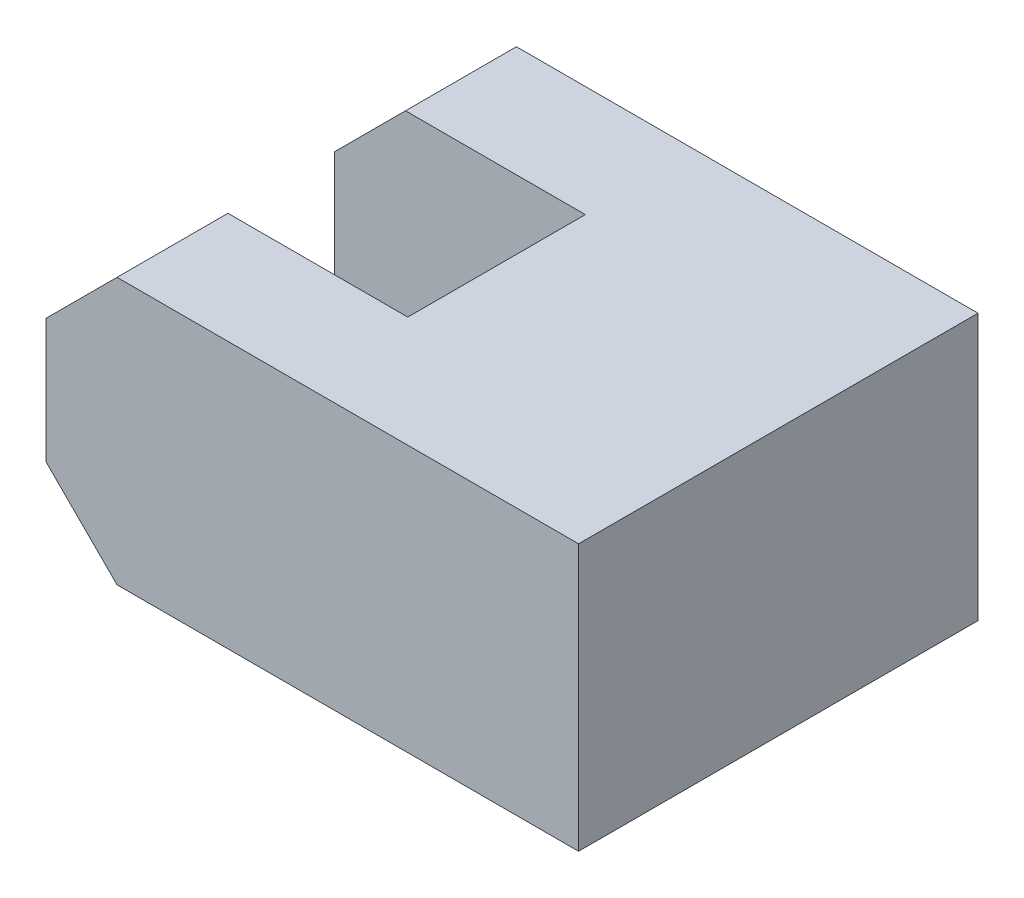
ISO-10303-21;
HEADER;
FILE_DESCRIPTION(('STEP AP214'),'2;1');
FILE_NAME('part.step','',(''),(''),'','','');
FILE_SCHEMA(('AUTOMOTIVE_DESIGN { 1 0 10303 214 1 1 1 1 }'));
ENDSEC;
DATA;
#1=APPLICATION_CONTEXT('core data for automotive mechanical design processes');
#2=APPLICATION_PROTOCOL_DEFINITION('international standard','automotive_design',2000,#1);
#3=PRODUCT_CONTEXT('',#1,'mechanical');
#4=PRODUCT('Part','Part','',(#3));
#5=PRODUCT_RELATED_PRODUCT_CATEGORY('part','',(#4));
#6=PRODUCT_DEFINITION_FORMATION('','',#4);
#7=PRODUCT_DEFINITION_CONTEXT('part definition',#1,'design');
#8=PRODUCT_DEFINITION('design','',#6,#7);
#9=PRODUCT_DEFINITION_SHAPE('','',#8);
#10=(LENGTH_UNIT() NAMED_UNIT(*) SI_UNIT(.MILLI.,.METRE.));
#11=(NAMED_UNIT(*) PLANE_ANGLE_UNIT() SI_UNIT($,.RADIAN.));
#12=(NAMED_UNIT(*) SI_UNIT($,.STERADIAN.) SOLID_ANGLE_UNIT());
#13=UNCERTAINTY_MEASURE_WITH_UNIT(LENGTH_MEASURE(1.E-05),#10,'distance_accuracy_value','');
#14=(GEOMETRIC_REPRESENTATION_CONTEXT(3) GLOBAL_UNCERTAINTY_ASSIGNED_CONTEXT((#13)) GLOBAL_UNIT_ASSIGNED_CONTEXT((#10,
#11,#12)) REPRESENTATION_CONTEXT('',''));
#15=CARTESIAN_POINT('',(0.,0.,0.));
#16=DIRECTION('',(0.,0.,1.));
#17=DIRECTION('',(1.,0.,0.));
#18=AXIS2_PLACEMENT_3D('',#15,#16,#17);
#19=CARTESIAN_POINT('',(-49.0190633419129,30.,-22.5));
#20=DIRECTION('',(1.,0.,0.));
#21=DIRECTION('',(0.,0.,-1.));
#22=AXIS2_PLACEMENT_3D('',#19,#20,#21);
#23=PLANE('',#22);
#24=DIRECTION('',(0.,-1.,0.));
#25=VECTOR('',#24,1.);
#26=CARTESIAN_POINT('',(-49.0190633419129,30.,9.99999999999999));
#27=LINE('',#26,#25);
#28=CARTESIAN_POINT('',(-49.0190633419129,22.,9.99999999999999));
#29=VERTEX_POINT('',#28);
#30=CARTESIAN_POINT('',(-49.0190633419129,8.,9.99999999999999));
#31=VERTEX_POINT('',#30);
#32=EDGE_CURVE('E157',#29,#31,#27,.T.);
#33=ORIENTED_EDGE('',*,*,#32,.T.);
#34=DIRECTION('',(0.,0.,1.));
#35=VECTOR('',#34,1.);
#36=CARTESIAN_POINT('',(-49.0190633419129,8.,-22.5));
#37=LINE('',#36,#35);
#38=CARTESIAN_POINT('',(-49.0190633419129,8.00000000000001,22.5));
#39=VERTEX_POINT('',#38);
#40=EDGE_CURVE('E212',#31,#39,#37,.T.);
#41=ORIENTED_EDGE('',*,*,#40,.T.);
#42=DIRECTION('',(0.,-1.,0.));
#43=VECTOR('',#42,1.);
#44=CARTESIAN_POINT('',(-49.0190633419129,30.,22.5));
#45=LINE('',#44,#43);
#46=CARTESIAN_POINT('',(-49.0190633419129,22.,22.5));
#47=VERTEX_POINT('',#46);
#48=EDGE_CURVE('E179',#47,#39,#45,.T.);
#49=ORIENTED_EDGE('',*,*,#48,.F.);
#50=DIRECTION('',(0.,0.,-1.));
#51=VECTOR('',#50,1.);
#52=CARTESIAN_POINT('',(-49.0190633419129,22.,9.99999999999999));
#53=LINE('',#52,#51);
#54=EDGE_CURVE('E210',#47,#29,#53,.T.);
#55=ORIENTED_EDGE('',*,*,#54,.T.);
#56=EDGE_LOOP('',(#33,#41,#49,#55));
#57=FACE_BOUND('',#56,.T.);
#58=ADVANCED_FACE('F31',(#57),#23,.F.);
#59=CARTESIAN_POINT('',(10.9809366580871,30.,-22.5));
#60=DIRECTION('',(-1.,0.,0.));
#61=DIRECTION('',(0.,0.,1.));
#62=AXIS2_PLACEMENT_3D('',#59,#60,#61);
#63=PLANE('',#62);
#64=DIRECTION('',(0.,0.,-1.));
#65=VECTOR('',#64,1.);
#66=CARTESIAN_POINT('',(10.9809366580871,0.,-22.5));
#67=LINE('',#66,#65);
#68=CARTESIAN_POINT('',(10.9809366580871,0.,22.5));
#69=VERTEX_POINT('',#68);
#70=CARTESIAN_POINT('',(10.9809366580871,0.,-22.5));
#71=VERTEX_POINT('',#70);
#72=EDGE_CURVE('E160',#69,#71,#67,.T.);
#73=ORIENTED_EDGE('',*,*,#72,.T.);
#74=DIRECTION('',(0.,-1.,0.));
#75=VECTOR('',#74,1.);
#76=CARTESIAN_POINT('',(10.9809366580871,30.,-22.5));
#77=LINE('',#76,#75);
#78=CARTESIAN_POINT('',(10.9809366580871,30.,-22.5));
#79=VERTEX_POINT('',#78);
#80=EDGE_CURVE('E184',#79,#71,#77,.T.);
#81=ORIENTED_EDGE('',*,*,#80,.F.);
#82=DIRECTION('',(0.,0.,-1.));
#83=VECTOR('',#82,1.);
#84=CARTESIAN_POINT('',(10.9809366580871,30.,-22.5));
#85=LINE('',#84,#83);
#86=CARTESIAN_POINT('',(10.9809366580871,30.,22.5));
#87=VERTEX_POINT('',#86);
#88=EDGE_CURVE('E161',#87,#79,#85,.T.);
#89=ORIENTED_EDGE('',*,*,#88,.F.);
#90=DIRECTION('',(0.,-1.,0.));
#91=VECTOR('',#90,1.);
#92=CARTESIAN_POINT('',(10.9809366580871,30.,22.5));
#93=LINE('',#92,#91);
#94=EDGE_CURVE('E170',#87,#69,#93,.T.);
#95=ORIENTED_EDGE('',*,*,#94,.T.);
#96=EDGE_LOOP('',(#73,#81,#89,#95));
#97=FACE_BOUND('',#96,.T.);
#98=ADVANCED_FACE('F242',(#97),#63,.F.);
#99=CARTESIAN_POINT('',(-49.0190633419129,30.,-22.5));
#100=DIRECTION('',(0.,0.,1.));
#101=DIRECTION('',(1.,0.,0.));
#102=AXIS2_PLACEMENT_3D('',#99,#100,#101);
#103=PLANE('',#102);
#104=DIRECTION('',(-1.,0.,0.));
#105=VECTOR('',#104,1.);
#106=CARTESIAN_POINT('',(-49.0190633419129,0.,-22.5));
#107=LINE('',#106,#105);
#108=CARTESIAN_POINT('',(-41.0190633419129,0.,-22.5));
#109=VERTEX_POINT('',#108);
#110=EDGE_CURVE('E173',#71,#109,#107,.T.);
#111=ORIENTED_EDGE('',*,*,#110,.T.);
#112=DIRECTION('',(0.707106781186549,-0.707106781186546,0.));
#113=VECTOR('',#112,1.);
#114=CARTESIAN_POINT('',(-49.0190633419129,8.,-22.5));
#115=LINE('',#114,#113);
#116=CARTESIAN_POINT('',(-49.0190633419129,8.00000000000001,-22.5));
#117=VERTEX_POINT('',#116);
#118=EDGE_CURVE('E202',#109,#117,#115,.F.);
#119=ORIENTED_EDGE('',*,*,#118,.T.);
#120=DIRECTION('',(0.,-1.,0.));
#121=VECTOR('',#120,1.);
#122=CARTESIAN_POINT('',(-49.0190633419129,30.,-22.5));
#123=LINE('',#122,#121);
#124=CARTESIAN_POINT('',(-49.0190633419129,22.,-22.5));
#125=VERTEX_POINT('',#124);
#126=EDGE_CURVE('E181',#125,#117,#123,.T.);
#127=ORIENTED_EDGE('',*,*,#126,.F.);
#128=DIRECTION('',(0.707106781186546,0.707106781186549,0.));
#129=VECTOR('',#128,1.);
#130=CARTESIAN_POINT('',(-41.019063341913,30.,-22.5));
#131=LINE('',#130,#129);
#132=CARTESIAN_POINT('',(-41.019063341913,30.,-22.5));
#133=VERTEX_POINT('',#132);
#134=EDGE_CURVE('E200',#125,#133,#131,.T.);
#135=ORIENTED_EDGE('',*,*,#134,.T.);
#136=DIRECTION('',(-1.,0.,0.));
#137=VECTOR('',#136,1.);
#138=CARTESIAN_POINT('',(-49.0190633419129,30.,-22.5));
#139=LINE('',#138,#137);
#140=EDGE_CURVE('E164',#79,#133,#139,.T.);
#141=ORIENTED_EDGE('',*,*,#140,.F.);
#142=ORIENTED_EDGE('',*,*,#80,.T.);
#143=EDGE_LOOP('',(#111,#119,#127,#135,#141,#142));
#144=FACE_BOUND('',#143,.T.);
#145=ADVANCED_FACE('F248',(#144),#103,.F.);
#146=ORIENTED_EDGE('',*,*,#126,.T.);
#147=DIRECTION('',(0.,0.,1.));
#148=VECTOR('',#147,1.);
#149=CARTESIAN_POINT('',(-49.0190633419129,8.,-22.5));
#150=LINE('',#149,#148);
#151=CARTESIAN_POINT('',(-49.0190633419129,8.00000000000001,-10.));
#152=VERTEX_POINT('',#151);
#153=EDGE_CURVE('E190',#117,#152,#150,.T.);
#154=ORIENTED_EDGE('',*,*,#153,.T.);
#155=DIRECTION('',(0.,1.,0.));
#156=VECTOR('',#155,1.);
#157=CARTESIAN_POINT('',(-49.0190633419129,30.,-10.));
#158=LINE('',#157,#156);
#159=CARTESIAN_POINT('',(-49.0190633419129,22.,-10.));
#160=VERTEX_POINT('',#159);
#161=EDGE_CURVE('E153',#152,#160,#158,.T.);
#162=ORIENTED_EDGE('',*,*,#161,.T.);
#163=DIRECTION('',(0.,0.,-1.));
#164=VECTOR('',#163,1.);
#165=CARTESIAN_POINT('',(-49.0190633419129,22.,-22.5));
#166=LINE('',#165,#164);
#167=EDGE_CURVE('E188',#160,#125,#166,.T.);
#168=ORIENTED_EDGE('',*,*,#167,.T.);
#169=EDGE_LOOP('',(#146,#154,#162,#168));
#170=FACE_BOUND('',#169,.T.);
#171=ADVANCED_FACE('F244',(#170),#23,.F.);
#172=CARTESIAN_POINT('',(-49.0190633419129,30.,22.5));
#173=DIRECTION('',(0.,0.,-1.));
#174=DIRECTION('',(-1.,0.,0.));
#175=AXIS2_PLACEMENT_3D('',#172,#173,#174);
#176=PLANE('',#175);
#177=ORIENTED_EDGE('',*,*,#48,.T.);
#178=DIRECTION('',(-0.707106781186549,0.707106781186546,0.));
#179=VECTOR('',#178,1.);
#180=CARTESIAN_POINT('',(-49.0190633419129,8.,22.5));
#181=LINE('',#180,#179);
#182=CARTESIAN_POINT('',(-41.0190633419129,0.,22.5));
#183=VERTEX_POINT('',#182);
#184=EDGE_CURVE('E46',#39,#183,#181,.F.);
#185=ORIENTED_EDGE('',*,*,#184,.T.);
#186=DIRECTION('',(1.,0.,0.));
#187=VECTOR('',#186,1.);
#188=CARTESIAN_POINT('',(-49.0190633419129,0.,22.5));
#189=LINE('',#188,#187);
#190=EDGE_CURVE('E165',#183,#69,#189,.T.);
#191=ORIENTED_EDGE('',*,*,#190,.T.);
#192=ORIENTED_EDGE('',*,*,#94,.F.);
#193=DIRECTION('',(1.,0.,0.));
#194=VECTOR('',#193,1.);
#195=CARTESIAN_POINT('',(-49.0190633419129,30.,22.5));
#196=LINE('',#195,#194);
#197=CARTESIAN_POINT('',(-41.019063341913,30.,22.5));
#198=VERTEX_POINT('',#197);
#199=EDGE_CURVE('E168',#198,#87,#196,.T.);
#200=ORIENTED_EDGE('',*,*,#199,.F.);
#201=DIRECTION('',(-0.707106781186546,-0.707106781186549,0.));
#202=VECTOR('',#201,1.);
#203=CARTESIAN_POINT('',(-41.019063341913,30.,22.5));
#204=LINE('',#203,#202);
#205=EDGE_CURVE('E54',#198,#47,#204,.T.);
#206=ORIENTED_EDGE('',*,*,#205,.T.);
#207=EDGE_LOOP('',(#177,#185,#191,#192,#200,#206));
#208=FACE_BOUND('',#207,.T.);
#209=ADVANCED_FACE('F226',(#208),#176,.F.);
#210=CARTESIAN_POINT('',(10.9809366580871,30.,22.5));
#211=DIRECTION('',(0.,1.,0.));
#212=DIRECTION('',(0.,0.,1.));
#213=AXIS2_PLACEMENT_3D('',#210,#211,#212);
#214=PLANE('',#213);
#215=ORIENTED_EDGE('',*,*,#140,.T.);
#216=DIRECTION('',(0.,0.,1.));
#217=VECTOR('',#216,1.);
#218=CARTESIAN_POINT('',(-41.019063341913,30.,-10.));
#219=LINE('',#218,#217);
#220=CARTESIAN_POINT('',(-41.019063341913,30.,-10.));
#221=VERTEX_POINT('',#220);
#222=EDGE_CURVE('E207',#133,#221,#219,.T.);
#223=ORIENTED_EDGE('',*,*,#222,.T.);
#224=DIRECTION('',(-1.,0.,0.));
#225=VECTOR('',#224,1.);
#226=CARTESIAN_POINT('',(-56.6304809391643,30.,-10.));
#227=LINE('',#226,#225);
#228=CARTESIAN_POINT('',(-20.7592731604488,30.,-10.));
#229=VERTEX_POINT('',#228);
#230=EDGE_CURVE('E148',#229,#221,#227,.T.);
#231=ORIENTED_EDGE('',*,*,#230,.F.);
#232=DIRECTION('',(0.,0.,-1.));
#233=VECTOR('',#232,1.);
#234=CARTESIAN_POINT('',(-20.7592731604488,30.,-10.));
#235=LINE('',#234,#233);
#236=CARTESIAN_POINT('',(-20.7592731604488,30.,9.99999999999999));
#237=VERTEX_POINT('',#236);
#238=EDGE_CURVE('E128',#237,#229,#235,.T.);
#239=ORIENTED_EDGE('',*,*,#238,.F.);
#240=DIRECTION('',(1.,0.,0.));
#241=VECTOR('',#240,1.);
#242=CARTESIAN_POINT('',(-56.6304809391643,30.,10.));
#243=LINE('',#242,#241);
#244=CARTESIAN_POINT('',(-41.019063341913,30.,9.99999999999999));
#245=VERTEX_POINT('',#244);
#246=EDGE_CURVE('E146',#245,#237,#243,.T.);
#247=ORIENTED_EDGE('',*,*,#246,.F.);
#248=DIRECTION('',(0.,0.,1.));
#249=VECTOR('',#248,1.);
#250=CARTESIAN_POINT('',(-41.019063341913,30.,22.5));
#251=LINE('',#250,#249);
#252=EDGE_CURVE('E204',#245,#198,#251,.T.);
#253=ORIENTED_EDGE('',*,*,#252,.T.);
#254=ORIENTED_EDGE('',*,*,#199,.T.);
#255=ORIENTED_EDGE('',*,*,#88,.T.);
#256=EDGE_LOOP('',(#215,#223,#231,#239,#247,#253,#254,#255));
#257=FACE_BOUND('',#256,.T.);
#258=ADVANCED_FACE('F224',(#257),#214,.T.);
#259=CARTESIAN_POINT('',(10.9809366580871,0.,22.5));
#260=DIRECTION('',(0.,1.,0.));
#261=DIRECTION('',(0.,0.,1.));
#262=AXIS2_PLACEMENT_3D('',#259,#260,#261);
#263=PLANE('',#262);
#264=DIRECTION('',(-1.,0.,0.));
#265=VECTOR('',#264,1.);
#266=CARTESIAN_POINT('',(-56.6304809391643,0.,-10.));
#267=LINE('',#266,#265);
#268=CARTESIAN_POINT('',(-20.7592731604488,0.,-10.));
#269=VERTEX_POINT('',#268);
#270=CARTESIAN_POINT('',(-41.0190633419129,0.,-10.));
#271=VERTEX_POINT('',#270);
#272=EDGE_CURVE('E133',#269,#271,#267,.T.);
#273=ORIENTED_EDGE('',*,*,#272,.T.);
#274=DIRECTION('',(0.,0.,-1.));
#275=VECTOR('',#274,1.);
#276=CARTESIAN_POINT('',(-41.0190633419129,0.,22.5));
#277=LINE('',#276,#275);
#278=EDGE_CURVE('E198',#271,#109,#277,.T.);
#279=ORIENTED_EDGE('',*,*,#278,.T.);
#280=ORIENTED_EDGE('',*,*,#110,.F.);
#281=ORIENTED_EDGE('',*,*,#72,.F.);
#282=ORIENTED_EDGE('',*,*,#190,.F.);
#283=DIRECTION('',(0.,0.,-1.));
#284=VECTOR('',#283,1.);
#285=CARTESIAN_POINT('',(-41.0190633419129,0.,22.5));
#286=LINE('',#285,#284);
#287=CARTESIAN_POINT('',(-41.0190633419129,0.,9.99999999999999));
#288=VERTEX_POINT('',#287);
#289=EDGE_CURVE('E196',#183,#288,#286,.T.);
#290=ORIENTED_EDGE('',*,*,#289,.T.);
#291=DIRECTION('',(1.,0.,0.));
#292=VECTOR('',#291,1.);
#293=CARTESIAN_POINT('',(10.9809366580871,0.,9.99999999999998));
#294=LINE('',#293,#292);
#295=CARTESIAN_POINT('',(-20.7592731604488,0.,9.99999999999999));
#296=VERTEX_POINT('',#295);
#297=EDGE_CURVE('E144',#288,#296,#294,.T.);
#298=ORIENTED_EDGE('',*,*,#297,.T.);
#299=DIRECTION('',(0.,0.,-1.));
#300=VECTOR('',#299,1.);
#301=CARTESIAN_POINT('',(-20.7592731604488,0.,-10.));
#302=LINE('',#301,#300);
#303=EDGE_CURVE('E126',#296,#269,#302,.T.);
#304=ORIENTED_EDGE('',*,*,#303,.T.);
#305=EDGE_LOOP('',(#273,#279,#280,#281,#282,#290,#298,#304));
#306=FACE_BOUND('',#305,.T.);
#307=ADVANCED_FACE('F142',(#306),#263,.F.);
#308=CARTESIAN_POINT('',(-56.6304809391643,0.,10.));
#309=DIRECTION('',(0.,0.,1.));
#310=DIRECTION('',(1.,0.,0.));
#311=AXIS2_PLACEMENT_3D('',#308,#309,#310);
#312=PLANE('',#311);
#313=ORIENTED_EDGE('',*,*,#297,.F.);
#314=DIRECTION('',(0.707106781186549,-0.707106781186546,0.));
#315=VECTOR('',#314,1.);
#316=CARTESIAN_POINT('',(-49.0190633419129,8.,9.99999999999999));
#317=LINE('',#316,#315);
#318=EDGE_CURVE('E11',#288,#31,#317,.F.);
#319=ORIENTED_EDGE('',*,*,#318,.T.);
#320=ORIENTED_EDGE('',*,*,#32,.F.);
#321=DIRECTION('',(0.707106781186546,0.707106781186549,0.));
#322=VECTOR('',#321,1.);
#323=CARTESIAN_POINT('',(-41.019063341913,30.,9.99999999999999));
#324=LINE('',#323,#322);
#325=EDGE_CURVE('E39',#29,#245,#324,.T.);
#326=ORIENTED_EDGE('',*,*,#325,.T.);
#327=ORIENTED_EDGE('',*,*,#246,.T.);
#328=DIRECTION('',(0.,1.,0.));
#329=VECTOR('',#328,1.);
#330=CARTESIAN_POINT('',(-20.7592731604488,0.,9.99999999999999));
#331=LINE('',#330,#329);
#332=EDGE_CURVE('E132',#296,#237,#331,.T.);
#333=ORIENTED_EDGE('',*,*,#332,.F.);
#334=EDGE_LOOP('',(#313,#319,#320,#326,#327,#333));
#335=FACE_BOUND('',#334,.T.);
#336=ADVANCED_FACE('F219',(#335),#312,.F.);
#337=CARTESIAN_POINT('',(-56.6304809391643,0.,-10.));
#338=DIRECTION('',(0.,0.,-1.));
#339=DIRECTION('',(-1.,0.,0.));
#340=AXIS2_PLACEMENT_3D('',#337,#338,#339);
#341=PLANE('',#340);
#342=ORIENTED_EDGE('',*,*,#161,.F.);
#343=DIRECTION('',(-0.707106781186549,0.707106781186546,0.));
#344=VECTOR('',#343,1.);
#345=CARTESIAN_POINT('',(-49.0190633419129,8.,-10.));
#346=LINE('',#345,#344);
#347=EDGE_CURVE('E138',#152,#271,#346,.F.);
#348=ORIENTED_EDGE('',*,*,#347,.T.);
#349=ORIENTED_EDGE('',*,*,#272,.F.);
#350=DIRECTION('',(0.,1.,0.));
#351=VECTOR('',#350,1.);
#352=CARTESIAN_POINT('',(-20.7592731604488,0.,-10.));
#353=LINE('',#352,#351);
#354=EDGE_CURVE('E121',#269,#229,#353,.T.);
#355=ORIENTED_EDGE('',*,*,#354,.T.);
#356=ORIENTED_EDGE('',*,*,#230,.T.);
#357=DIRECTION('',(-0.707106781186546,-0.707106781186549,0.));
#358=VECTOR('',#357,1.);
#359=CARTESIAN_POINT('',(-41.019063341913,30.,-10.));
#360=LINE('',#359,#358);
#361=EDGE_CURVE('E193',#221,#160,#360,.T.);
#362=ORIENTED_EDGE('',*,*,#361,.T.);
#363=EDGE_LOOP('',(#342,#348,#349,#355,#356,#362));
#364=FACE_BOUND('',#363,.T.);
#365=ADVANCED_FACE('F137',(#364),#341,.F.);
#366=CARTESIAN_POINT('',(-20.7592731604488,0.,-10.));
#367=DIRECTION('',(1.,0.,0.));
#368=DIRECTION('',(0.,0.,-1.));
#369=AXIS2_PLACEMENT_3D('',#366,#367,#368);
#370=PLANE('',#369);
#371=ORIENTED_EDGE('',*,*,#238,.T.);
#372=ORIENTED_EDGE('',*,*,#354,.F.);
#373=ORIENTED_EDGE('',*,*,#303,.F.);
#374=ORIENTED_EDGE('',*,*,#332,.T.);
#375=EDGE_LOOP('',(#371,#372,#373,#374));
#376=FACE_BOUND('',#375,.T.);
#377=ADVANCED_FACE('F123',(#376),#370,.F.);
#378=CARTESIAN_POINT('',(-49.0190633419129,8.,-22.5));
#379=DIRECTION('',(0.707106781186546,0.707106781186549,0.));
#380=DIRECTION('',(-0.707106781186549,0.707106781186546,0.));
#381=AXIS2_PLACEMENT_3D('',#378,#379,#380);
#382=PLANE('',#381);
#383=ORIENTED_EDGE('',*,*,#118,.F.);
#384=ORIENTED_EDGE('',*,*,#278,.F.);
#385=ORIENTED_EDGE('',*,*,#347,.F.);
#386=ORIENTED_EDGE('',*,*,#153,.F.);
#387=EDGE_LOOP('',(#383,#384,#385,#386));
#388=FACE_BOUND('',#387,.T.);
#389=ADVANCED_FACE('F238',(#388),#382,.F.);
#390=CARTESIAN_POINT('',(-41.019063341913,30.,22.5));
#391=DIRECTION('',(-0.707106781186549,0.707106781186546,0.));
#392=DIRECTION('',(-0.707106781186546,-0.707106781186549,0.));
#393=AXIS2_PLACEMENT_3D('',#390,#391,#392);
#394=PLANE('',#393);
#395=ORIENTED_EDGE('',*,*,#134,.F.);
#396=ORIENTED_EDGE('',*,*,#167,.F.);
#397=ORIENTED_EDGE('',*,*,#361,.F.);
#398=ORIENTED_EDGE('',*,*,#222,.F.);
#399=EDGE_LOOP('',(#395,#396,#397,#398));
#400=FACE_BOUND('',#399,.T.);
#401=ADVANCED_FACE('F233',(#400),#394,.T.);
#402=CARTESIAN_POINT('',(-49.0190633419129,8.,-22.5));
#403=DIRECTION('',(0.707106781186546,0.707106781186549,0.));
#404=DIRECTION('',(-0.707106781186549,0.707106781186546,0.));
#405=AXIS2_PLACEMENT_3D('',#402,#403,#404);
#406=PLANE('',#405);
#407=ORIENTED_EDGE('',*,*,#318,.F.);
#408=ORIENTED_EDGE('',*,*,#289,.F.);
#409=ORIENTED_EDGE('',*,*,#184,.F.);
#410=ORIENTED_EDGE('',*,*,#40,.F.);
#411=EDGE_LOOP('',(#407,#408,#409,#410));
#412=FACE_BOUND('',#411,.T.);
#413=ADVANCED_FACE('F231',(#412),#406,.F.);
#414=CARTESIAN_POINT('',(-41.019063341913,30.,22.5));
#415=DIRECTION('',(-0.707106781186549,0.707106781186546,0.));
#416=DIRECTION('',(-0.707106781186546,-0.707106781186549,0.));
#417=AXIS2_PLACEMENT_3D('',#414,#415,#416);
#418=PLANE('',#417);
#419=ORIENTED_EDGE('',*,*,#325,.F.);
#420=ORIENTED_EDGE('',*,*,#54,.F.);
#421=ORIENTED_EDGE('',*,*,#205,.F.);
#422=ORIENTED_EDGE('',*,*,#252,.F.);
#423=EDGE_LOOP('',(#419,#420,#421,#422));
#424=FACE_BOUND('',#423,.T.);
#425=ADVANCED_FACE('F33',(#424),#418,.T.);
#426=CLOSED_SHELL('',(#58,#98,#145,#171,#209,#258,#307,#336,#365,#377,#389,#401,#413,#425));
#427=MANIFOLD_SOLID_BREP('B2',#426);
#428=ADVANCED_BREP_SHAPE_REPRESENTATION('',(#18,#427),#14);
#429=SHAPE_DEFINITION_REPRESENTATION(#9,#428);
ENDSEC;
END-ISO-10303-21;
